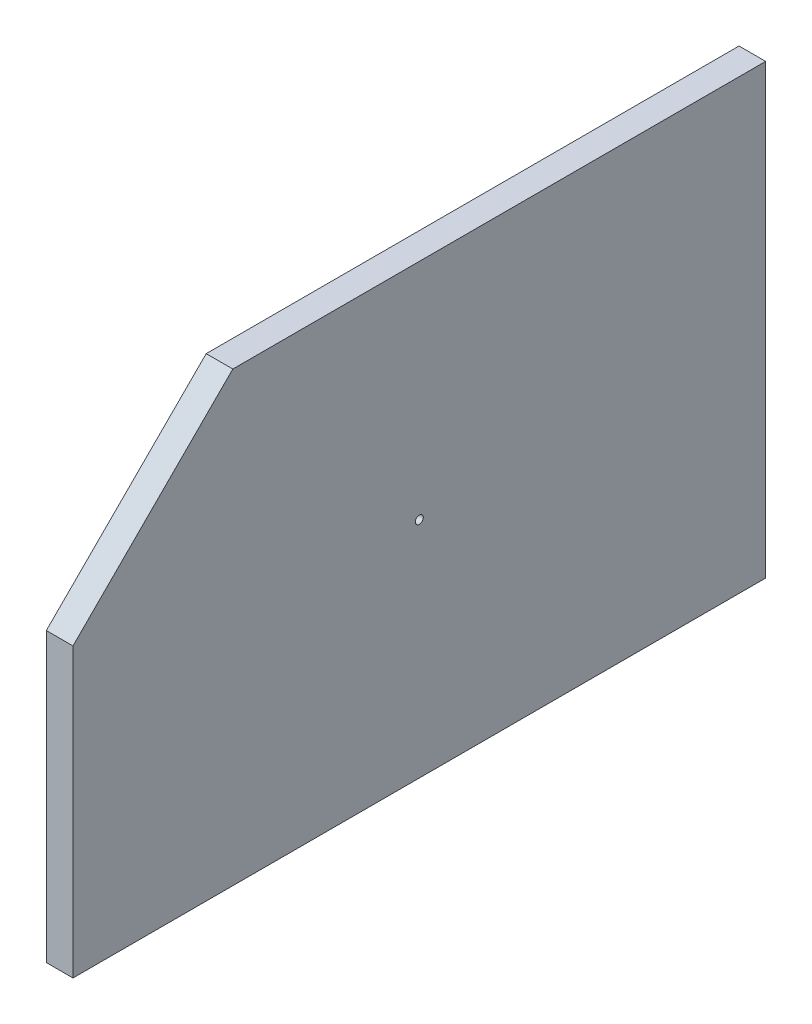
ISO-10303-21;
HEADER;
FILE_DESCRIPTION(('STEP AP214'),'2;1');
FILE_NAME('part.step','',(''),(''),'','','');
FILE_SCHEMA(('AUTOMOTIVE_DESIGN { 1 0 10303 214 1 1 1 1 }'));
ENDSEC;
DATA;
#1=APPLICATION_CONTEXT('core data for automotive mechanical design processes');
#2=APPLICATION_PROTOCOL_DEFINITION('international standard','automotive_design',2000,#1);
#3=PRODUCT_CONTEXT('',#1,'mechanical');
#4=PRODUCT('Part','Part','',(#3));
#5=PRODUCT_RELATED_PRODUCT_CATEGORY('part','',(#4));
#6=PRODUCT_DEFINITION_FORMATION('','',#4);
#7=PRODUCT_DEFINITION_CONTEXT('part definition',#1,'design');
#8=PRODUCT_DEFINITION('design','',#6,#7);
#9=PRODUCT_DEFINITION_SHAPE('','',#8);
#10=(LENGTH_UNIT() NAMED_UNIT(*) SI_UNIT(.MILLI.,.METRE.));
#11=(NAMED_UNIT(*) PLANE_ANGLE_UNIT() SI_UNIT($,.RADIAN.));
#12=(NAMED_UNIT(*) SI_UNIT($,.STERADIAN.) SOLID_ANGLE_UNIT());
#13=UNCERTAINTY_MEASURE_WITH_UNIT(LENGTH_MEASURE(1.E-05),#10,'distance_accuracy_value','');
#14=(GEOMETRIC_REPRESENTATION_CONTEXT(3) GLOBAL_UNCERTAINTY_ASSIGNED_CONTEXT((#13)) GLOBAL_UNIT_ASSIGNED_CONTEXT((#10,
#11,#12)) REPRESENTATION_CONTEXT('',''));
#15=CARTESIAN_POINT('',(0.,0.,0.));
#16=DIRECTION('',(0.,0.,1.));
#17=DIRECTION('',(1.,0.,0.));
#18=AXIS2_PLACEMENT_3D('',#15,#16,#17);
#19=CARTESIAN_POINT('',(10.,107.95,0.));
#20=DIRECTION('',(0.,0.,-1.));
#21=DIRECTION('',(0.,1.,0.));
#22=AXIS2_PLACEMENT_3D('',#19,#20,#21);
#23=PLANE('',#22);
#24=DIRECTION('',(0.,-1.,0.));
#25=VECTOR('',#24,1.);
#26=CARTESIAN_POINT('',(0.,107.95,0.));
#27=LINE('',#26,#25);
#28=CARTESIAN_POINT('',(0.,107.95,0.));
#29=VERTEX_POINT('',#28);
#30=CARTESIAN_POINT('',(0.,0.,0.));
#31=VERTEX_POINT('',#30);
#32=EDGE_CURVE('E113',#29,#31,#27,.T.);
#33=ORIENTED_EDGE('',*,*,#32,.T.);
#34=DIRECTION('',(-1.,0.,0.));
#35=VECTOR('',#34,1.);
#36=CARTESIAN_POINT('',(10.,0.,0.));
#37=LINE('',#36,#35);
#38=CARTESIAN_POINT('',(10.,0.,0.));
#39=VERTEX_POINT('',#38);
#40=EDGE_CURVE('E11',#39,#31,#37,.T.);
#41=ORIENTED_EDGE('',*,*,#40,.F.);
#42=DIRECTION('',(0.,-1.,0.));
#43=VECTOR('',#42,1.);
#44=CARTESIAN_POINT('',(10.,107.95,0.));
#45=LINE('',#44,#43);
#46=CARTESIAN_POINT('',(10.,107.95,0.));
#47=VERTEX_POINT('',#46);
#48=EDGE_CURVE('E122',#47,#39,#45,.T.);
#49=ORIENTED_EDGE('',*,*,#48,.F.);
#50=DIRECTION('',(-1.,0.,0.));
#51=VECTOR('',#50,1.);
#52=CARTESIAN_POINT('',(10.,107.95,0.));
#53=LINE('',#52,#51);
#54=EDGE_CURVE('E109',#47,#29,#53,.T.);
#55=ORIENTED_EDGE('',*,*,#54,.T.);
#56=EDGE_LOOP('',(#33,#41,#49,#55));
#57=FACE_BOUND('',#56,.T.);
#58=ADVANCED_FACE('F39',(#57),#23,.F.);
#59=CARTESIAN_POINT('',(10.,0.,0.));
#60=DIRECTION('',(0.,1.,0.));
#61=DIRECTION('',(0.,0.,1.));
#62=AXIS2_PLACEMENT_3D('',#59,#60,#61);
#63=PLANE('',#62);
#64=DIRECTION('',(0.,0.,-1.));
#65=VECTOR('',#64,1.);
#66=CARTESIAN_POINT('',(0.,0.,0.));
#67=LINE('',#66,#65);
#68=CARTESIAN_POINT('',(0.,0.,-260.));
#69=VERTEX_POINT('',#68);
#70=EDGE_CURVE('E116',#31,#69,#67,.T.);
#71=ORIENTED_EDGE('',*,*,#70,.T.);
#72=DIRECTION('',(-1.,0.,0.));
#73=VECTOR('',#72,1.);
#74=CARTESIAN_POINT('',(10.,0.,-260.));
#75=LINE('',#74,#73);
#76=CARTESIAN_POINT('',(10.,0.,-260.));
#77=VERTEX_POINT('',#76);
#78=EDGE_CURVE('E47',#77,#69,#75,.T.);
#79=ORIENTED_EDGE('',*,*,#78,.F.);
#80=DIRECTION('',(0.,0.,-1.));
#81=VECTOR('',#80,1.);
#82=CARTESIAN_POINT('',(10.,0.,0.));
#83=LINE('',#82,#81);
#84=EDGE_CURVE('E89',#39,#77,#83,.T.);
#85=ORIENTED_EDGE('',*,*,#84,.F.);
#86=ORIENTED_EDGE('',*,*,#40,.T.);
#87=EDGE_LOOP('',(#71,#79,#85,#86));
#88=FACE_BOUND('',#87,.T.);
#89=ADVANCED_FACE('F142',(#88),#63,.F.);
#90=CARTESIAN_POINT('',(10.,0.,-260.));
#91=DIRECTION('',(0.,0.,1.));
#92=DIRECTION('',(1.,0.,0.));
#93=AXIS2_PLACEMENT_3D('',#90,#91,#92);
#94=PLANE('',#93);
#95=DIRECTION('',(0.,1.,0.));
#96=VECTOR('',#95,1.);
#97=CARTESIAN_POINT('',(0.,0.,-260.));
#98=LINE('',#97,#96);
#99=CARTESIAN_POINT('',(0.,167.95,-260.));
#100=VERTEX_POINT('',#99);
#101=EDGE_CURVE('E104',#69,#100,#98,.T.);
#102=ORIENTED_EDGE('',*,*,#101,.T.);
#103=DIRECTION('',(-1.,0.,0.));
#104=VECTOR('',#103,1.);
#105=CARTESIAN_POINT('',(10.,167.95,-260.));
#106=LINE('',#105,#104);
#107=CARTESIAN_POINT('',(10.,167.95,-260.));
#108=VERTEX_POINT('',#107);
#109=EDGE_CURVE('E101',#108,#100,#106,.T.);
#110=ORIENTED_EDGE('',*,*,#109,.F.);
#111=DIRECTION('',(0.,1.,0.));
#112=VECTOR('',#111,1.);
#113=CARTESIAN_POINT('',(10.,0.,-260.));
#114=LINE('',#113,#112);
#115=EDGE_CURVE('E93',#77,#108,#114,.T.);
#116=ORIENTED_EDGE('',*,*,#115,.F.);
#117=ORIENTED_EDGE('',*,*,#78,.T.);
#118=EDGE_LOOP('',(#102,#110,#116,#117));
#119=FACE_BOUND('',#118,.T.);
#120=ADVANCED_FACE('F102',(#119),#94,.F.);
#121=CARTESIAN_POINT('',(10.,167.95,-260.));
#122=DIRECTION('',(0.,-1.,0.));
#123=DIRECTION('',(0.,0.,-1.));
#124=AXIS2_PLACEMENT_3D('',#121,#122,#123);
#125=PLANE('',#124);
#126=DIRECTION('',(0.,0.,1.));
#127=VECTOR('',#126,1.);
#128=CARTESIAN_POINT('',(0.,167.95,-260.));
#129=LINE('',#128,#127);
#130=CARTESIAN_POINT('',(0.,167.95,-60.));
#131=VERTEX_POINT('',#130);
#132=EDGE_CURVE('E75',#100,#131,#129,.T.);
#133=ORIENTED_EDGE('',*,*,#132,.T.);
#134=DIRECTION('',(-1.,0.,0.));
#135=VECTOR('',#134,1.);
#136=CARTESIAN_POINT('',(10.,167.95,-60.));
#137=LINE('',#136,#135);
#138=CARTESIAN_POINT('',(10.,167.95,-60.));
#139=VERTEX_POINT('',#138);
#140=EDGE_CURVE('E105',#139,#131,#137,.T.);
#141=ORIENTED_EDGE('',*,*,#140,.F.);
#142=DIRECTION('',(0.,0.,1.));
#143=VECTOR('',#142,1.);
#144=CARTESIAN_POINT('',(10.,167.95,-260.));
#145=LINE('',#144,#143);
#146=EDGE_CURVE('E97',#108,#139,#145,.T.);
#147=ORIENTED_EDGE('',*,*,#146,.F.);
#148=ORIENTED_EDGE('',*,*,#109,.T.);
#149=EDGE_LOOP('',(#133,#141,#147,#148));
#150=FACE_BOUND('',#149,.T.);
#151=ADVANCED_FACE('F107',(#150),#125,.F.);
#152=CARTESIAN_POINT('',(10.,167.95,-60.));
#153=DIRECTION('',(0.,-0.707106781186548,-0.707106781186547));
#154=DIRECTION('',(0.,0.707106781186547,-0.707106781186548));
#155=AXIS2_PLACEMENT_3D('',#152,#153,#154);
#156=PLANE('',#155);
#157=DIRECTION('',(0.,-0.707106781186547,0.707106781186548));
#158=VECTOR('',#157,1.);
#159=CARTESIAN_POINT('',(0.,167.95,-60.));
#160=LINE('',#159,#158);
#161=EDGE_CURVE('E81',#131,#29,#160,.T.);
#162=ORIENTED_EDGE('',*,*,#161,.T.);
#163=ORIENTED_EDGE('',*,*,#54,.F.);
#164=DIRECTION('',(0.,-0.707106781186547,0.707106781186548));
#165=VECTOR('',#164,1.);
#166=CARTESIAN_POINT('',(10.,167.95,-60.));
#167=LINE('',#166,#165);
#168=EDGE_CURVE('E55',#139,#47,#167,.T.);
#169=ORIENTED_EDGE('',*,*,#168,.F.);
#170=ORIENTED_EDGE('',*,*,#140,.T.);
#171=EDGE_LOOP('',(#162,#163,#169,#170));
#172=FACE_BOUND('',#171,.T.);
#173=ADVANCED_FACE('F130',(#172),#156,.F.);
#174=CARTESIAN_POINT('',(10.,0.,0.));
#175=DIRECTION('',(1.,0.,0.));
#176=DIRECTION('',(0.,0.,-1.));
#177=AXIS2_PLACEMENT_3D('',#174,#175,#176);
#178=PLANE('',#177);
#179=CARTESIAN_POINT('',(10.,83.975,-130.));
#180=DIRECTION('',(1.,0.,0.));
#181=DIRECTION('',(0.,0.,-1.));
#182=AXIS2_PLACEMENT_3D('',#179,#180,#181);
#183=CIRCLE('',#182,1.5);
#184=CARTESIAN_POINT('',(10.,83.975,-131.5));
#185=VERTEX_POINT('',#184);
#186=EDGE_CURVE('E185',#185,#185,#183,.T.);
#187=ORIENTED_EDGE('',*,*,#186,.F.);
#188=EDGE_LOOP('',(#187));
#189=FACE_BOUND('',#188,.T.);
#190=ORIENTED_EDGE('',*,*,#48,.T.);
#191=ORIENTED_EDGE('',*,*,#84,.T.);
#192=ORIENTED_EDGE('',*,*,#115,.T.);
#193=ORIENTED_EDGE('',*,*,#146,.T.);
#194=ORIENTED_EDGE('',*,*,#168,.T.);
#195=EDGE_LOOP('',(#190,#191,#192,#193,#194));
#196=FACE_BOUND('',#195,.T.);
#197=ADVANCED_FACE('F95',(#189,#196),#178,.T.);
#198=CARTESIAN_POINT('',(0.,0.,0.));
#199=DIRECTION('',(1.,0.,0.));
#200=DIRECTION('',(0.,0.,-1.));
#201=AXIS2_PLACEMENT_3D('',#198,#199,#200);
#202=PLANE('',#201);
#203=CARTESIAN_POINT('',(0.,83.975,-130.));
#204=DIRECTION('',(1.,0.,0.));
#205=DIRECTION('',(0.,0.,-1.));
#206=AXIS2_PLACEMENT_3D('',#203,#204,#205);
#207=CIRCLE('',#206,1.5);
#208=CARTESIAN_POINT('',(0.,83.975,-131.5));
#209=VERTEX_POINT('',#208);
#210=EDGE_CURVE('E117',#209,#209,#207,.T.);
#211=ORIENTED_EDGE('',*,*,#210,.T.);
#212=EDGE_LOOP('',(#211));
#213=FACE_BOUND('',#212,.T.);
#214=ORIENTED_EDGE('',*,*,#32,.F.);
#215=ORIENTED_EDGE('',*,*,#161,.F.);
#216=ORIENTED_EDGE('',*,*,#132,.F.);
#217=ORIENTED_EDGE('',*,*,#101,.F.);
#218=ORIENTED_EDGE('',*,*,#70,.F.);
#219=EDGE_LOOP('',(#214,#215,#216,#217,#218));
#220=FACE_BOUND('',#219,.T.);
#221=ADVANCED_FACE('F126',(#213,#220),#202,.F.);
#222=CARTESIAN_POINT('',(0.,83.975,-130.));
#223=DIRECTION('',(1.,0.,0.));
#224=DIRECTION('',(0.,0.,-1.));
#225=AXIS2_PLACEMENT_3D('',#222,#223,#224);
#226=CYLINDRICAL_SURFACE('',#225,1.5);
#227=ORIENTED_EDGE('',*,*,#210,.F.);
#228=EDGE_LOOP('',(#227));
#229=FACE_BOUND('',#228,.T.);
#230=ORIENTED_EDGE('',*,*,#186,.T.);
#231=EDGE_LOOP('',(#230));
#232=FACE_BOUND('',#231,.T.);
#233=ADVANCED_FACE('F169',(#229,#232),#226,.F.);
#234=CLOSED_SHELL('',(#58,#89,#120,#151,#173,#197,#221,#233));
#235=MANIFOLD_SOLID_BREP('B2',#234);
#236=ADVANCED_BREP_SHAPE_REPRESENTATION('',(#18,#235),#14);
#237=SHAPE_DEFINITION_REPRESENTATION(#9,#236);
ENDSEC;
END-ISO-10303-21;
